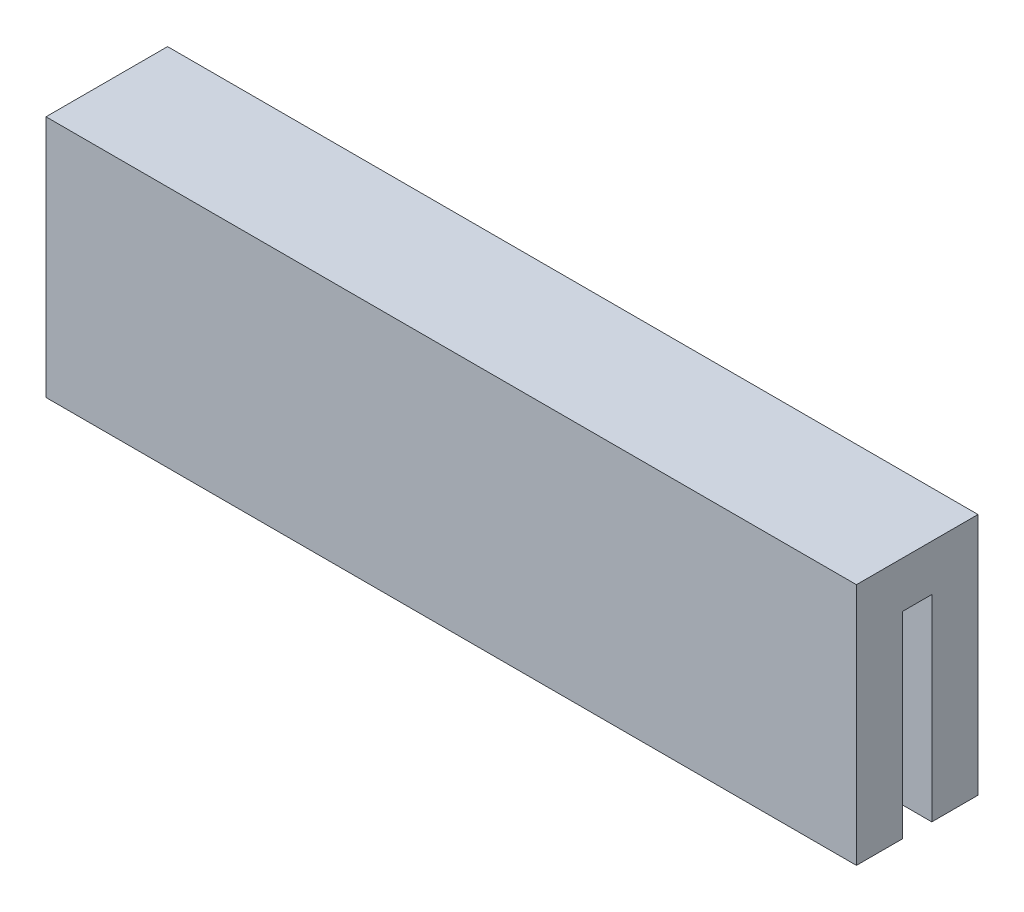
ISO-10303-21;
HEADER;
FILE_DESCRIPTION(('STEP AP214'),'2;1');
FILE_NAME('part.step','',(''),(''),'','','');
FILE_SCHEMA(('AUTOMOTIVE_DESIGN { 1 0 10303 214 1 1 1 1 }'));
ENDSEC;
DATA;
#1=APPLICATION_CONTEXT('core data for automotive mechanical design processes');
#2=APPLICATION_PROTOCOL_DEFINITION('international standard','automotive_design',2000,#1);
#3=PRODUCT_CONTEXT('',#1,'mechanical');
#4=PRODUCT('Part','Part','',(#3));
#5=PRODUCT_RELATED_PRODUCT_CATEGORY('part','',(#4));
#6=PRODUCT_DEFINITION_FORMATION('','',#4);
#7=PRODUCT_DEFINITION_CONTEXT('part definition',#1,'design');
#8=PRODUCT_DEFINITION('design','',#6,#7);
#9=PRODUCT_DEFINITION_SHAPE('','',#8);
#10=(LENGTH_UNIT() NAMED_UNIT(*) SI_UNIT(.MILLI.,.METRE.));
#11=(NAMED_UNIT(*) PLANE_ANGLE_UNIT() SI_UNIT($,.RADIAN.));
#12=(NAMED_UNIT(*) SI_UNIT($,.STERADIAN.) SOLID_ANGLE_UNIT());
#13=UNCERTAINTY_MEASURE_WITH_UNIT(LENGTH_MEASURE(1.E-05),#10,'distance_accuracy_value','');
#14=(GEOMETRIC_REPRESENTATION_CONTEXT(3) GLOBAL_UNCERTAINTY_ASSIGNED_CONTEXT((#13)) GLOBAL_UNIT_ASSIGNED_CONTEXT((#10,
#11,#12)) REPRESENTATION_CONTEXT('',''));
#15=CARTESIAN_POINT('',(0.,0.,0.));
#16=DIRECTION('',(0.,0.,1.));
#17=DIRECTION('',(1.,0.,0.));
#18=AXIS2_PLACEMENT_3D('',#15,#16,#17);
#19=CARTESIAN_POINT('',(0.,0.,0.));
#20=DIRECTION('',(0.,1.,0.));
#21=DIRECTION('',(0.,0.,1.));
#22=AXIS2_PLACEMENT_3D('',#19,#20,#21);
#23=PLANE('',#22);
#24=DIRECTION('',(0.,0.,1.));
#25=VECTOR('',#24,1.);
#26=CARTESIAN_POINT('',(0.,0.,0.));
#27=LINE('',#26,#25);
#28=CARTESIAN_POINT('',(0.,0.,9.3));
#29=VERTEX_POINT('',#28);
#30=CARTESIAN_POINT('',(0.,0.,15.));
#31=VERTEX_POINT('',#30);
#32=EDGE_CURVE('E142',#29,#31,#27,.T.);
#33=ORIENTED_EDGE('',*,*,#32,.F.);
#34=DIRECTION('',(-1.,0.,0.));
#35=VECTOR('',#34,1.);
#36=CARTESIAN_POINT('',(0.,0.,9.3));
#37=LINE('',#36,#35);
#38=CARTESIAN_POINT('',(100.,0.,9.3));
#39=VERTEX_POINT('',#38);
#40=EDGE_CURVE('E122',#39,#29,#37,.T.);
#41=ORIENTED_EDGE('',*,*,#40,.F.);
#42=DIRECTION('',(0.,0.,-1.));
#43=VECTOR('',#42,1.);
#44=CARTESIAN_POINT('',(100.,0.,0.));
#45=LINE('',#44,#43);
#46=CARTESIAN_POINT('',(100.,0.,15.));
#47=VERTEX_POINT('',#46);
#48=EDGE_CURVE('E145',#47,#39,#45,.T.);
#49=ORIENTED_EDGE('',*,*,#48,.F.);
#50=DIRECTION('',(1.,0.,0.));
#51=VECTOR('',#50,1.);
#52=CARTESIAN_POINT('',(0.,0.,15.));
#53=LINE('',#52,#51);
#54=EDGE_CURVE('E141',#31,#47,#53,.T.);
#55=ORIENTED_EDGE('',*,*,#54,.F.);
#56=EDGE_LOOP('',(#33,#41,#49,#55));
#57=FACE_BOUND('',#56,.T.);
#58=ADVANCED_FACE('F33',(#57),#23,.F.);
#59=CARTESIAN_POINT('',(0.,30.,0.));
#60=DIRECTION('',(1.,0.,0.));
#61=DIRECTION('',(0.,0.,-1.));
#62=AXIS2_PLACEMENT_3D('',#59,#60,#61);
#63=PLANE('',#62);
#64=DIRECTION('',(0.,0.,-1.));
#65=VECTOR('',#64,1.);
#66=CARTESIAN_POINT('',(0.,24.3,9.3));
#67=LINE('',#66,#65);
#68=CARTESIAN_POINT('',(0.,24.3,9.3));
#69=VERTEX_POINT('',#68);
#70=CARTESIAN_POINT('',(0.,24.3,5.7));
#71=VERTEX_POINT('',#70);
#72=EDGE_CURVE('E113',#69,#71,#67,.T.);
#73=ORIENTED_EDGE('',*,*,#72,.F.);
#74=DIRECTION('',(0.,-1.,0.));
#75=VECTOR('',#74,1.);
#76=CARTESIAN_POINT('',(0.,24.3,9.3));
#77=LINE('',#76,#75);
#78=EDGE_CURVE('E167',#69,#29,#77,.T.);
#79=ORIENTED_EDGE('',*,*,#78,.T.);
#80=ORIENTED_EDGE('',*,*,#32,.T.);
#81=DIRECTION('',(0.,-1.,0.));
#82=VECTOR('',#81,1.);
#83=CARTESIAN_POINT('',(0.,30.,15.));
#84=LINE('',#83,#82);
#85=CARTESIAN_POINT('',(0.,30.,15.));
#86=VERTEX_POINT('',#85);
#87=EDGE_CURVE('E11',#86,#31,#84,.T.);
#88=ORIENTED_EDGE('',*,*,#87,.F.);
#89=DIRECTION('',(0.,0.,1.));
#90=VECTOR('',#89,1.);
#91=CARTESIAN_POINT('',(0.,30.,0.));
#92=LINE('',#91,#90);
#93=CARTESIAN_POINT('',(0.,30.,0.));
#94=VERTEX_POINT('',#93);
#95=EDGE_CURVE('E133',#94,#86,#92,.T.);
#96=ORIENTED_EDGE('',*,*,#95,.F.);
#97=DIRECTION('',(0.,-1.,0.));
#98=VECTOR('',#97,1.);
#99=CARTESIAN_POINT('',(0.,30.,0.));
#100=LINE('',#99,#98);
#101=CARTESIAN_POINT('',(0.,0.,0.));
#102=VERTEX_POINT('',#101);
#103=EDGE_CURVE('E139',#94,#102,#100,.T.);
#104=ORIENTED_EDGE('',*,*,#103,.T.);
#105=CARTESIAN_POINT('',(0.,0.,5.7));
#106=VERTEX_POINT('',#105);
#107=EDGE_CURVE('E126',#102,#106,#27,.T.);
#108=ORIENTED_EDGE('',*,*,#107,.T.);
#109=DIRECTION('',(0.,-1.,0.));
#110=VECTOR('',#109,1.);
#111=CARTESIAN_POINT('',(0.,24.3,5.7));
#112=LINE('',#111,#110);
#113=EDGE_CURVE('E48',#71,#106,#112,.T.);
#114=ORIENTED_EDGE('',*,*,#113,.F.);
#115=EDGE_LOOP('',(#73,#79,#80,#88,#96,#104,#108,#114));
#116=FACE_BOUND('',#115,.T.);
#117=ADVANCED_FACE('F35',(#116),#63,.F.);
#118=CARTESIAN_POINT('',(0.,30.,15.));
#119=DIRECTION('',(0.,0.,-1.));
#120=DIRECTION('',(-1.,0.,0.));
#121=AXIS2_PLACEMENT_3D('',#118,#119,#120);
#122=PLANE('',#121);
#123=ORIENTED_EDGE('',*,*,#54,.T.);
#124=DIRECTION('',(0.,-1.,0.));
#125=VECTOR('',#124,1.);
#126=CARTESIAN_POINT('',(100.,30.,15.));
#127=LINE('',#126,#125);
#128=CARTESIAN_POINT('',(100.,30.,15.));
#129=VERTEX_POINT('',#128);
#130=EDGE_CURVE('E41',#129,#47,#127,.T.);
#131=ORIENTED_EDGE('',*,*,#130,.F.);
#132=DIRECTION('',(1.,0.,0.));
#133=VECTOR('',#132,1.);
#134=CARTESIAN_POINT('',(0.,30.,15.));
#135=LINE('',#134,#133);
#136=EDGE_CURVE('E85',#86,#129,#135,.T.);
#137=ORIENTED_EDGE('',*,*,#136,.F.);
#138=ORIENTED_EDGE('',*,*,#87,.T.);
#139=EDGE_LOOP('',(#123,#131,#137,#138));
#140=FACE_BOUND('',#139,.T.);
#141=ADVANCED_FACE('F188',(#140),#122,.F.);
#142=CARTESIAN_POINT('',(100.,30.,0.));
#143=DIRECTION('',(-1.,0.,0.));
#144=DIRECTION('',(0.,0.,1.));
#145=AXIS2_PLACEMENT_3D('',#142,#143,#144);
#146=PLANE('',#145);
#147=ORIENTED_EDGE('',*,*,#48,.T.);
#148=DIRECTION('',(0.,-1.,0.));
#149=VECTOR('',#148,1.);
#150=CARTESIAN_POINT('',(100.,24.3,9.3));
#151=LINE('',#150,#149);
#152=CARTESIAN_POINT('',(100.,24.3,9.3));
#153=VERTEX_POINT('',#152);
#154=EDGE_CURVE('E128',#153,#39,#151,.T.);
#155=ORIENTED_EDGE('',*,*,#154,.F.);
#156=DIRECTION('',(0.,0.,1.));
#157=VECTOR('',#156,1.);
#158=CARTESIAN_POINT('',(100.,24.3,9.3));
#159=LINE('',#158,#157);
#160=CARTESIAN_POINT('',(100.,24.3,5.7));
#161=VERTEX_POINT('',#160);
#162=EDGE_CURVE('E112',#161,#153,#159,.T.);
#163=ORIENTED_EDGE('',*,*,#162,.F.);
#164=DIRECTION('',(0.,-1.,0.));
#165=VECTOR('',#164,1.);
#166=CARTESIAN_POINT('',(100.,24.3,5.7));
#167=LINE('',#166,#165);
#168=CARTESIAN_POINT('',(100.,0.,5.7));
#169=VERTEX_POINT('',#168);
#170=EDGE_CURVE('E109',#161,#169,#167,.T.);
#171=ORIENTED_EDGE('',*,*,#170,.T.);
#172=CARTESIAN_POINT('',(100.,0.,0.));
#173=VERTEX_POINT('',#172);
#174=EDGE_CURVE('E144',#169,#173,#45,.T.);
#175=ORIENTED_EDGE('',*,*,#174,.T.);
#176=DIRECTION('',(0.,-1.,0.));
#177=VECTOR('',#176,1.);
#178=CARTESIAN_POINT('',(100.,30.,0.));
#179=LINE('',#178,#177);
#180=CARTESIAN_POINT('',(100.,30.,0.));
#181=VERTEX_POINT('',#180);
#182=EDGE_CURVE('E150',#181,#173,#179,.T.);
#183=ORIENTED_EDGE('',*,*,#182,.F.);
#184=DIRECTION('',(0.,0.,-1.));
#185=VECTOR('',#184,1.);
#186=CARTESIAN_POINT('',(100.,30.,0.));
#187=LINE('',#186,#185);
#188=EDGE_CURVE('E136',#129,#181,#187,.T.);
#189=ORIENTED_EDGE('',*,*,#188,.F.);
#190=ORIENTED_EDGE('',*,*,#130,.T.);
#191=EDGE_LOOP('',(#147,#155,#163,#171,#175,#183,#189,#190));
#192=FACE_BOUND('',#191,.T.);
#193=ADVANCED_FACE('F155',(#192),#146,.F.);
#194=CARTESIAN_POINT('',(0.,30.,0.));
#195=DIRECTION('',(0.,0.,1.));
#196=DIRECTION('',(1.,0.,0.));
#197=AXIS2_PLACEMENT_3D('',#194,#195,#196);
#198=PLANE('',#197);
#199=DIRECTION('',(-1.,0.,0.));
#200=VECTOR('',#199,1.);
#201=CARTESIAN_POINT('',(0.,0.,0.));
#202=LINE('',#201,#200);
#203=EDGE_CURVE('E78',#173,#102,#202,.T.);
#204=ORIENTED_EDGE('',*,*,#203,.T.);
#205=ORIENTED_EDGE('',*,*,#103,.F.);
#206=DIRECTION('',(-1.,0.,0.));
#207=VECTOR('',#206,1.);
#208=CARTESIAN_POINT('',(0.,30.,0.));
#209=LINE('',#208,#207);
#210=EDGE_CURVE('E57',#181,#94,#209,.T.);
#211=ORIENTED_EDGE('',*,*,#210,.F.);
#212=ORIENTED_EDGE('',*,*,#182,.T.);
#213=EDGE_LOOP('',(#204,#205,#211,#212));
#214=FACE_BOUND('',#213,.T.);
#215=ADVANCED_FACE('F181',(#214),#198,.F.);
#216=CARTESIAN_POINT('',(0.,30.,0.));
#217=DIRECTION('',(0.,1.,0.));
#218=DIRECTION('',(0.,0.,1.));
#219=AXIS2_PLACEMENT_3D('',#216,#217,#218);
#220=PLANE('',#219);
#221=ORIENTED_EDGE('',*,*,#95,.T.);
#222=ORIENTED_EDGE('',*,*,#136,.T.);
#223=ORIENTED_EDGE('',*,*,#188,.T.);
#224=ORIENTED_EDGE('',*,*,#210,.T.);
#225=EDGE_LOOP('',(#221,#222,#223,#224));
#226=FACE_BOUND('',#225,.T.);
#227=ADVANCED_FACE('F174',(#226),#220,.T.);
#228=ORIENTED_EDGE('',*,*,#174,.F.);
#229=DIRECTION('',(1.,0.,0.));
#230=VECTOR('',#229,1.);
#231=CARTESIAN_POINT('',(0.,0.,5.7));
#232=LINE('',#231,#230);
#233=EDGE_CURVE('E163',#106,#169,#232,.T.);
#234=ORIENTED_EDGE('',*,*,#233,.F.);
#235=ORIENTED_EDGE('',*,*,#107,.F.);
#236=ORIENTED_EDGE('',*,*,#203,.F.);
#237=EDGE_LOOP('',(#228,#234,#235,#236));
#238=FACE_BOUND('',#237,.T.);
#239=ADVANCED_FACE('F172',(#238),#23,.F.);
#240=CARTESIAN_POINT('',(0.,24.3,9.3));
#241=DIRECTION('',(0.,0.,1.));
#242=DIRECTION('',(1.,0.,0.));
#243=AXIS2_PLACEMENT_3D('',#240,#241,#242);
#244=PLANE('',#243);
#245=ORIENTED_EDGE('',*,*,#40,.T.);
#246=ORIENTED_EDGE('',*,*,#78,.F.);
#247=DIRECTION('',(-1.,0.,0.));
#248=VECTOR('',#247,1.);
#249=CARTESIAN_POINT('',(0.,24.3,9.3));
#250=LINE('',#249,#248);
#251=EDGE_CURVE('E119',#153,#69,#250,.T.);
#252=ORIENTED_EDGE('',*,*,#251,.F.);
#253=ORIENTED_EDGE('',*,*,#154,.T.);
#254=EDGE_LOOP('',(#245,#246,#252,#253));
#255=FACE_BOUND('',#254,.T.);
#256=ADVANCED_FACE('F168',(#255),#244,.F.);
#257=CARTESIAN_POINT('',(0.,24.3,5.7));
#258=DIRECTION('',(0.,0.,-1.));
#259=DIRECTION('',(-1.,0.,0.));
#260=AXIS2_PLACEMENT_3D('',#257,#258,#259);
#261=PLANE('',#260);
#262=ORIENTED_EDGE('',*,*,#233,.T.);
#263=ORIENTED_EDGE('',*,*,#170,.F.);
#264=DIRECTION('',(1.,0.,0.));
#265=VECTOR('',#264,1.);
#266=CARTESIAN_POINT('',(0.,24.3,5.7));
#267=LINE('',#266,#265);
#268=EDGE_CURVE('E105',#71,#161,#267,.T.);
#269=ORIENTED_EDGE('',*,*,#268,.F.);
#270=ORIENTED_EDGE('',*,*,#113,.T.);
#271=EDGE_LOOP('',(#262,#263,#269,#270));
#272=FACE_BOUND('',#271,.T.);
#273=ADVANCED_FACE('F107',(#272),#261,.F.);
#274=CARTESIAN_POINT('',(0.,24.3,0.));
#275=DIRECTION('',(0.,-1.,0.));
#276=DIRECTION('',(0.,0.,-1.));
#277=AXIS2_PLACEMENT_3D('',#274,#275,#276);
#278=PLANE('',#277);
#279=ORIENTED_EDGE('',*,*,#72,.T.);
#280=ORIENTED_EDGE('',*,*,#268,.T.);
#281=ORIENTED_EDGE('',*,*,#162,.T.);
#282=ORIENTED_EDGE('',*,*,#251,.T.);
#283=EDGE_LOOP('',(#279,#280,#281,#282));
#284=FACE_BOUND('',#283,.T.);
#285=ADVANCED_FACE('F117',(#284),#278,.T.);
#286=CLOSED_SHELL('',(#58,#117,#141,#193,#215,#227,#239,#256,#273,#285));
#287=MANIFOLD_SOLID_BREP('B2',#286);
#288=ADVANCED_BREP_SHAPE_REPRESENTATION('',(#18,#287),#14);
#289=SHAPE_DEFINITION_REPRESENTATION(#9,#288);
ENDSEC;
END-ISO-10303-21;
